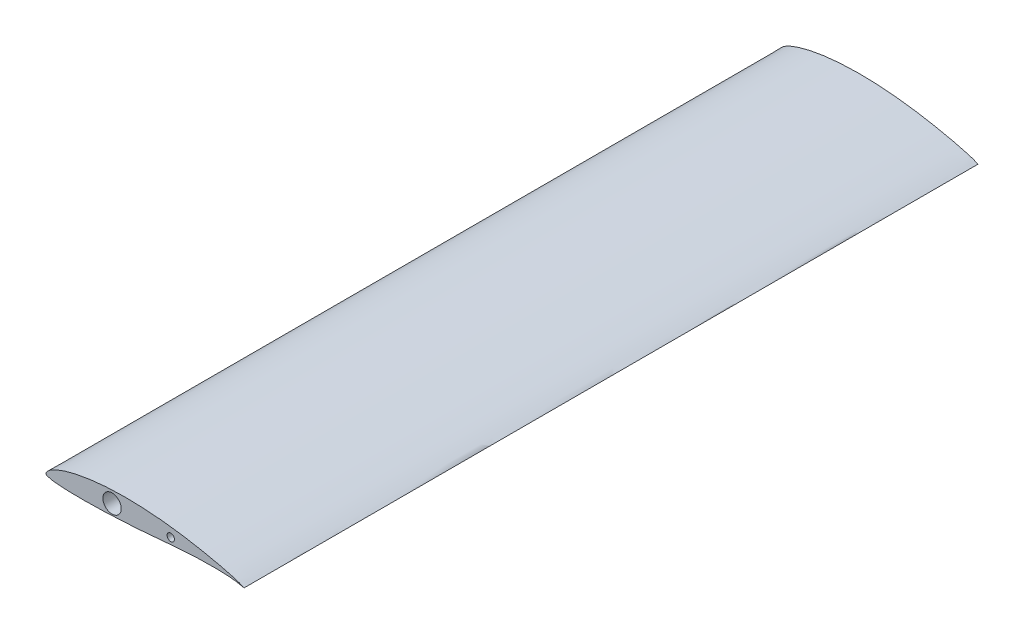
ISO-10303-21;
HEADER;
FILE_DESCRIPTION(('STEP AP214'),'2;1');
FILE_NAME('part.step','',(''),(''),'','','');
FILE_SCHEMA(('AUTOMOTIVE_DESIGN { 1 0 10303 214 1 1 1 1 }'));
ENDSEC;
DATA;
#1=APPLICATION_CONTEXT('core data for automotive mechanical design processes');
#2=APPLICATION_PROTOCOL_DEFINITION('international standard','automotive_design',2000,#1);
#3=PRODUCT_CONTEXT('',#1,'mechanical');
#4=PRODUCT('Part','Part','',(#3));
#5=PRODUCT_RELATED_PRODUCT_CATEGORY('part','',(#4));
#6=PRODUCT_DEFINITION_FORMATION('','',#4);
#7=PRODUCT_DEFINITION_CONTEXT('part definition',#1,'design');
#8=PRODUCT_DEFINITION('design','',#6,#7);
#9=PRODUCT_DEFINITION_SHAPE('','',#8);
#10=(LENGTH_UNIT() NAMED_UNIT(*) SI_UNIT(.MILLI.,.METRE.));
#11=(NAMED_UNIT(*) PLANE_ANGLE_UNIT() SI_UNIT($,.RADIAN.));
#12=(NAMED_UNIT(*) SI_UNIT($,.STERADIAN.) SOLID_ANGLE_UNIT());
#13=UNCERTAINTY_MEASURE_WITH_UNIT(LENGTH_MEASURE(1.E-05),#10,'distance_accuracy_value','');
#14=(GEOMETRIC_REPRESENTATION_CONTEXT(3) GLOBAL_UNCERTAINTY_ASSIGNED_CONTEXT((#13)) GLOBAL_UNIT_ASSIGNED_CONTEXT((#10,
#11,#12)) REPRESENTATION_CONTEXT('',''));
#15=CARTESIAN_POINT('',(0.,0.,0.));
#16=DIRECTION('',(0.,0.,1.));
#17=DIRECTION('',(1.,0.,0.));
#18=AXIS2_PLACEMENT_3D('',#15,#16,#17);
#19=CARTESIAN_POINT('',(270.,0.,-1000.));
#20=CARTESIAN_POINT('',(269.997712349188,0.0234686611256753,-1000.));
#21=CARTESIAN_POINT('',(268.237544940999,0.666521838597682,-1000.));
#22=CARTESIAN_POINT('',(266.567167257241,1.46678966420109,-1000.));
#23=CARTESIAN_POINT('',(262.675565234946,3.01541236049875,-1000.));
#24=CARTESIAN_POINT('',(257.913204906047,4.57241999430303,-1000.));
#25=CARTESIAN_POINT('',(251.73204691059,6.33251118051269,-1000.));
#26=CARTESIAN_POINT('',(244.411227291845,8.23757547132939,-1000.));
#27=CARTESIAN_POINT('',(235.957624235031,10.2728144558493,-1000.));
#28=CARTESIAN_POINT('',(226.514158981901,12.3893388504072,-1000.));
#29=CARTESIAN_POINT('',(216.193353242997,14.5408619660615,-1000.));
#30=CARTESIAN_POINT('',(205.131334675445,16.6775446846104,-1000.));
#31=CARTESIAN_POINT('',(193.456704411805,18.7297695998892,-1000.));
#32=CARTESIAN_POINT('',(181.297741572979,20.6324475689059,-1000.));
#33=CARTESIAN_POINT('',(168.767775931884,22.3116653675687,-1000.));
#34=CARTESIAN_POINT('',(155.975282970602,23.7079240823725,-1000.));
#35=CARTESIAN_POINT('',(143.035274216822,24.8048562112978,-1000.));
#36=CARTESIAN_POINT('',(130.061683689652,25.5801941607533,-1000.));
#37=CARTESIAN_POINT('',(117.173431648326,26.0002870023156,-1000.));
#38=CARTESIAN_POINT('',(104.483656181065,26.0575961543031,-1000.));
#39=CARTESIAN_POINT('',(92.1043755010552,25.7531475308751,-1000.));
#40=CARTESIAN_POINT('',(80.1394774009738,25.0742351928149,-1000.));
#41=CARTESIAN_POINT('',(68.6900371078556,24.0380742657958,-1000.));
#42=CARTESIAN_POINT('',(57.8508881437444,22.6699130708634,-1000.));
#43=CARTESIAN_POINT('',(47.7143437152034,21.012498661415,-1000.));
#44=CARTESIAN_POINT('',(38.3731688496213,19.0872173409911,-1000.));
#45=CARTESIAN_POINT('',(29.9084239228661,16.9557577669825,-1000.));
#46=CARTESIAN_POINT('',(22.3989734163653,14.6443999986465,-1000.));
#47=CARTESIAN_POINT('',(15.9079033402757,12.2158951402086,-1000.));
#48=CARTESIAN_POINT('',(10.4843260994342,9.72016383184442,-1000.));
#49=CARTESIAN_POINT('',(6.17701570310239,7.22086075585639,-1000.));
#50=CARTESIAN_POINT('',(2.96116420805311,4.74120142257406,-1000.));
#51=CARTESIAN_POINT('',(0.976626840598714,2.42611562982906,-1000.));
#52=CARTESIAN_POINT('',(0.0237044844557384,0.790715423622603,-1000.));
#53=CARTESIAN_POINT('',(-0.0162040088825778,-0.469721469617103,-1000.));
#54=CARTESIAN_POINT('',(0.800260735100484,-1.83607096740891,-1000.));
#55=CARTESIAN_POINT('',(3.49214110344745,-2.62953771203089,-1000.));
#56=CARTESIAN_POINT('',(7.30797165240786,-3.66267648937733,-1000.));
#57=CARTESIAN_POINT('',(12.6565956454472,-4.39911743413203,-1000.));
#58=CARTESIAN_POINT('',(19.3193886145286,-5.03288942314606,-1000.));
#59=CARTESIAN_POINT('',(27.2905068620494,-5.46979820264928,-1000.));
#60=CARTESIAN_POINT('',(36.4621699832966,-5.73867476423236,-1000.));
#61=CARTESIAN_POINT('',(46.7414412352293,-5.84000525497753,-1000.));
#62=CARTESIAN_POINT('',(58.0104590527028,-5.77015970140565,-1000.));
#63=CARTESIAN_POINT('',(70.1433505727269,-5.53682953906036,-1000.));
#64=CARTESIAN_POINT('',(83.0071440525755,-5.14081230033932,-1000.));
#65=CARTESIAN_POINT('',(96.4628511642711,-4.56590673235837,-1000.));
#66=CARTESIAN_POINT('',(110.37398366241,-3.8270098283305,-1000.));
#67=CARTESIAN_POINT('',(124.616655035357,-2.89299856695057,-1000.));
#68=CARTESIAN_POINT('',(139.099460234209,-1.73634558064927,-1000.));
#69=CARTESIAN_POINT('',(153.734791933855,-0.400812922822165,-1000.));
#70=CARTESIAN_POINT('',(168.40973375314,0.892284934259414,-1000.));
#71=CARTESIAN_POINT('',(182.933903609888,2.04143507217637,-1000.));
#72=CARTESIAN_POINT('',(197.078170060053,2.95921503400767,-1000.));
#73=CARTESIAN_POINT('',(210.604377411182,3.57903703483429,-1000.));
#74=CARTESIAN_POINT('',(223.266715876022,3.87437613460032,-1000.));
#75=CARTESIAN_POINT('',(234.840539210252,3.81861077039356,-1000.));
#76=CARTESIAN_POINT('',(245.04773169024,3.45329310537476,-1000.));
#77=CARTESIAN_POINT('',(253.77858024118,2.76286493967301,-1000.));
#78=CARTESIAN_POINT('',(260.440654454045,1.94222962723521,-1000.));
#79=CARTESIAN_POINT('',(265.781454331532,0.929874856989155,-1000.));
#80=CARTESIAN_POINT('',(267.932950880897,0.533749209448357,-1000.));
#81=CARTESIAN_POINT('',(270.002416438342,-0.0247898727749039,-1000.));
#82=CARTESIAN_POINT('',(270.,0.,-1000.));
#83=B_SPLINE_CURVE_WITH_KNOTS('',3,(#19,#20,#21,#22,#23,#24,#25,#26,#27,#28,#29,#30,#31,#32,#33,
#34,#35,#36,#37,#38,#39,#40,#41,#42,#43,#44,#45,#46,#47,#48,#49,#50,#51,#52,#53,#54,#55,#56,#57,
#58,#59,#60,#61,#62,#63,#64,#65,#66,#67,#68,#69,#70,#71,#72,#73,#74,#75,#76,#77,#78,#79,#80,#81,
#82),.UNSPECIFIED.,.T.,.F.,(4,1,1,1,1,1,1,1,1,1,1,1,1,1,1,1,1,1,1,1,1,1,1,1,1,1,1,1,1,1,1,1,1,1,
1,1,1,1,1,1,1,1,1,1,1,1,1,1,1,1,1,1,1,1,1,1,1,1,1,1,1,4),(0.,0.00169352365364151,
0.00639544747949767,0.0134616508959298,0.0227535749736499,0.0343673071517184,0.0481910226954883,
0.064031392481717,0.0816806172414247,0.100894124121338,0.121431793819588,0.143025453493653,
0.165434010835678,0.188439038764568,0.211855124404938,0.235496289450678,0.259143745164546,
0.282614908314604,0.30570154453718,0.328231583662433,0.350030433806964,0.370943883213179,
0.390816528552158,0.409505873078083,0.426856550273814,0.442733384525219,0.457018387509693,
0.469615069942757,0.480449695456551,0.489471860268703,0.496730301180351,0.502329146614106,
0.506255660132997,0.506441944995434,0.509181515928635,0.513913846214958,0.521178418676576,
0.530944156675701,0.543144508951145,0.557669673966592,0.574383525920581,0.593109554408618,
0.613638211877394,0.635743557157375,0.659184094922803,0.683713689413154,0.709075753928382,
0.735036066440786,0.761429738598203,0.7881837663948,0.815056829999431,0.84164476376198,
0.867513560484753,0.892232408519161,0.915363656349594,0.936485324642643,0.955199831872162,
0.971104187426938,0.983751025641108,0.992812817585366,0.998211136302568,1.),.UNSPECIFIED.);
#84=DIRECTION('',(0.,0.,1.));
#85=VECTOR('',#84,1.);
#86=SURFACE_OF_LINEAR_EXTRUSION('',#83,#85);
#87=CARTESIAN_POINT('',(270.,0.,-1000.));
#88=VERTEX_POINT('',#87);
#89=EDGE_CURVE('E10',#88,#88,#83,.T.);
#90=ORIENTED_EDGE('',*,*,#89,.T.);
#91=EDGE_LOOP('',(#90));
#92=FACE_BOUND('',#91,.T.);
#93=CARTESIAN_POINT('',(270.,0.,0.));
#94=CARTESIAN_POINT('',(269.997712349188,0.0234686611256753,0.));
#95=CARTESIAN_POINT('',(268.237544940999,0.666521838597682,0.));
#96=CARTESIAN_POINT('',(266.567167257241,1.46678966420109,0.));
#97=CARTESIAN_POINT('',(262.675565234946,3.01541236049875,0.));
#98=CARTESIAN_POINT('',(257.913204906047,4.57241999430303,0.));
#99=CARTESIAN_POINT('',(251.73204691059,6.33251118051269,0.));
#100=CARTESIAN_POINT('',(244.411227291845,8.23757547132939,0.));
#101=CARTESIAN_POINT('',(235.957624235031,10.2728144558493,0.));
#102=CARTESIAN_POINT('',(226.514158981901,12.3893388504072,0.));
#103=CARTESIAN_POINT('',(216.193353242997,14.5408619660615,0.));
#104=CARTESIAN_POINT('',(205.131334675445,16.6775446846104,0.));
#105=CARTESIAN_POINT('',(193.456704411805,18.7297695998892,0.));
#106=CARTESIAN_POINT('',(181.297741572979,20.6324475689059,0.));
#107=CARTESIAN_POINT('',(168.767775931884,22.3116653675687,0.));
#108=CARTESIAN_POINT('',(155.975282970602,23.7079240823725,0.));
#109=CARTESIAN_POINT('',(143.035274216822,24.8048562112978,0.));
#110=CARTESIAN_POINT('',(130.061683689652,25.5801941607533,0.));
#111=CARTESIAN_POINT('',(117.173431648326,26.0002870023156,0.));
#112=CARTESIAN_POINT('',(104.483656181065,26.0575961543031,0.));
#113=CARTESIAN_POINT('',(92.1043755010552,25.7531475308751,0.));
#114=CARTESIAN_POINT('',(80.1394774009738,25.0742351928149,0.));
#115=CARTESIAN_POINT('',(68.6900371078556,24.0380742657958,0.));
#116=CARTESIAN_POINT('',(57.8508881437444,22.6699130708634,0.));
#117=CARTESIAN_POINT('',(47.7143437152034,21.012498661415,0.));
#118=CARTESIAN_POINT('',(38.3731688496213,19.0872173409911,0.));
#119=CARTESIAN_POINT('',(29.9084239228661,16.9557577669825,0.));
#120=CARTESIAN_POINT('',(22.3989734163653,14.6443999986465,0.));
#121=CARTESIAN_POINT('',(15.9079033402757,12.2158951402086,0.));
#122=CARTESIAN_POINT('',(10.4843260994342,9.72016383184442,0.));
#123=CARTESIAN_POINT('',(6.17701570310239,7.22086075585639,0.));
#124=CARTESIAN_POINT('',(2.96116420805311,4.74120142257406,0.));
#125=CARTESIAN_POINT('',(0.976626840598714,2.42611562982906,0.));
#126=CARTESIAN_POINT('',(0.0237044844557384,0.790715423622603,0.));
#127=CARTESIAN_POINT('',(-0.0162040088825778,-0.469721469617103,0.));
#128=CARTESIAN_POINT('',(0.800260735100484,-1.83607096740891,0.));
#129=CARTESIAN_POINT('',(3.49214110344745,-2.62953771203089,0.));
#130=CARTESIAN_POINT('',(7.30797165240786,-3.66267648937733,0.));
#131=CARTESIAN_POINT('',(12.6565956454472,-4.39911743413203,0.));
#132=CARTESIAN_POINT('',(19.3193886145286,-5.03288942314606,0.));
#133=CARTESIAN_POINT('',(27.2905068620494,-5.46979820264928,0.));
#134=CARTESIAN_POINT('',(36.4621699832966,-5.73867476423236,0.));
#135=CARTESIAN_POINT('',(46.7414412352293,-5.84000525497753,0.));
#136=CARTESIAN_POINT('',(58.0104590527028,-5.77015970140565,0.));
#137=CARTESIAN_POINT('',(70.1433505727269,-5.53682953906036,0.));
#138=CARTESIAN_POINT('',(83.0071440525755,-5.14081230033932,0.));
#139=CARTESIAN_POINT('',(96.4628511642711,-4.56590673235837,0.));
#140=CARTESIAN_POINT('',(110.37398366241,-3.8270098283305,0.));
#141=CARTESIAN_POINT('',(124.616655035357,-2.89299856695057,0.));
#142=CARTESIAN_POINT('',(139.099460234209,-1.73634558064927,0.));
#143=CARTESIAN_POINT('',(153.734791933855,-0.400812922822165,0.));
#144=CARTESIAN_POINT('',(168.40973375314,0.892284934259414,0.));
#145=CARTESIAN_POINT('',(182.933903609888,2.04143507217637,0.));
#146=CARTESIAN_POINT('',(197.078170060053,2.95921503400767,0.));
#147=CARTESIAN_POINT('',(210.604377411182,3.57903703483429,0.));
#148=CARTESIAN_POINT('',(223.266715876022,3.87437613460032,0.));
#149=CARTESIAN_POINT('',(234.840539210252,3.81861077039356,0.));
#150=CARTESIAN_POINT('',(245.04773169024,3.45329310537476,0.));
#151=CARTESIAN_POINT('',(253.77858024118,2.76286493967301,0.));
#152=CARTESIAN_POINT('',(260.440654454045,1.94222962723521,0.));
#153=CARTESIAN_POINT('',(265.781454331532,0.929874856989155,0.));
#154=CARTESIAN_POINT('',(267.932950880897,0.533749209448357,0.));
#155=CARTESIAN_POINT('',(270.002416438342,-0.0247898727749039,0.));
#156=CARTESIAN_POINT('',(270.,0.,0.));
#157=B_SPLINE_CURVE_WITH_KNOTS('',3,(#93,#94,#95,#96,#97,#98,#99,#100,#101,#102,#103,#104,#105,
#106,#107,#108,#109,#110,#111,#112,#113,#114,#115,#116,#117,#118,#119,#120,#121,#122,#123,#124,
#125,#126,#127,#128,#129,#130,#131,#132,#133,#134,#135,#136,#137,#138,#139,#140,#141,#142,#143,
#144,#145,#146,#147,#148,#149,#150,#151,#152,#153,#154,#155,#156),.UNSPECIFIED.,.T.,.F.,(4,1,1,
1,1,1,1,1,1,1,1,1,1,1,1,1,1,1,1,1,1,1,1,1,1,1,1,1,1,1,1,1,1,1,1,1,1,1,1,1,1,1,1,1,1,1,1,1,1,1,1,
1,1,1,1,1,1,1,1,1,1,4),(0.,0.00169352365364151,0.00639544747949767,0.0134616508959298,
0.0227535749736499,0.0343673071517184,0.0481910226954883,0.064031392481717,0.0816806172414247,
0.100894124121338,0.121431793819588,0.143025453493653,0.165434010835678,0.188439038764568,
0.211855124404938,0.235496289450678,0.259143745164546,0.282614908314604,0.30570154453718,
0.328231583662433,0.350030433806964,0.370943883213179,0.390816528552158,0.409505873078083,
0.426856550273814,0.442733384525219,0.457018387509693,0.469615069942757,0.480449695456551,
0.489471860268703,0.496730301180351,0.502329146614106,0.506255660132997,0.506441944995434,
0.509181515928635,0.513913846214958,0.521178418676576,0.530944156675701,0.543144508951145,
0.557669673966592,0.574383525920581,0.593109554408618,0.613638211877394,0.635743557157375,
0.659184094922803,0.683713689413154,0.709075753928382,0.735036066440786,0.761429738598203,
0.7881837663948,0.815056829999431,0.84164476376198,0.867513560484753,0.892232408519161,
0.915363656349594,0.936485324642643,0.955199831872162,0.971104187426938,0.983751025641108,
0.992812817585366,0.998211136302568,1.),.UNSPECIFIED.);
#158=CARTESIAN_POINT('',(270.,0.,0.));
#159=VERTEX_POINT('',#158);
#160=EDGE_CURVE('E39',#159,#159,#157,.T.);
#161=ORIENTED_EDGE('',*,*,#160,.F.);
#162=EDGE_LOOP('',(#161));
#163=FACE_BOUND('',#162,.T.);
#164=ADVANCED_FACE('F35',(#92,#163),#86,.T.);
#165=CARTESIAN_POINT('',(1.62332381853687,3.13497524933791,-1000.));
#166=DIRECTION('',(0.,0.,1.));
#167=DIRECTION('',(-1.,0.,0.));
#168=AXIS2_PLACEMENT_3D('',#165,#166,#167);
#169=PLANE('',#168);
#170=CARTESIAN_POINT('',(90.,9.60326732864512,-1000.));
#171=DIRECTION('',(0.,0.,1.));
#172=DIRECTION('',(1.,0.,0.));
#173=AXIS2_PLACEMENT_3D('',#170,#171,#172);
#174=CIRCLE('',#173,12.5);
#175=CARTESIAN_POINT('',(102.5,9.60326732864512,-1000.));
#176=VERTEX_POINT('',#175);
#177=EDGE_CURVE('E47',#176,#176,#174,.T.);
#178=ORIENTED_EDGE('',*,*,#177,.T.);
#179=EDGE_LOOP('',(#178));
#180=FACE_BOUND('',#179,.T.);
#181=CARTESIAN_POINT('',(170.,9.60326732864512,-1000.));
#182=DIRECTION('',(0.,0.,1.));
#183=DIRECTION('',(1.,0.,0.));
#184=AXIS2_PLACEMENT_3D('',#181,#182,#183);
#185=CIRCLE('',#184,4.99999999999999);
#186=CARTESIAN_POINT('',(175.,9.60326732864512,-1000.));
#187=VERTEX_POINT('',#186);
#188=EDGE_CURVE('E52',#187,#187,#185,.T.);
#189=ORIENTED_EDGE('',*,*,#188,.T.);
#190=EDGE_LOOP('',(#189));
#191=FACE_BOUND('',#190,.T.);
#192=ORIENTED_EDGE('',*,*,#89,.F.);
#193=EDGE_LOOP('',(#192));
#194=FACE_BOUND('',#193,.T.);
#195=ADVANCED_FACE('F67',(#180,#191,#194),#169,.F.);
#196=CARTESIAN_POINT('',(1.62332381853687,3.13497524933791,0.));
#197=DIRECTION('',(0.,0.,1.));
#198=DIRECTION('',(-1.,0.,0.));
#199=AXIS2_PLACEMENT_3D('',#196,#197,#198);
#200=PLANE('',#199);
#201=CARTESIAN_POINT('',(90.,9.60326732864512,0.));
#202=DIRECTION('',(0.,0.,1.));
#203=DIRECTION('',(1.,0.,0.));
#204=AXIS2_PLACEMENT_3D('',#201,#202,#203);
#205=CIRCLE('',#204,12.5);
#206=CARTESIAN_POINT('',(102.5,9.60326732864512,0.));
#207=VERTEX_POINT('',#206);
#208=EDGE_CURVE('E61',#207,#207,#205,.T.);
#209=ORIENTED_EDGE('',*,*,#208,.F.);
#210=EDGE_LOOP('',(#209));
#211=FACE_BOUND('',#210,.T.);
#212=CARTESIAN_POINT('',(170.,9.60326732864512,0.));
#213=DIRECTION('',(0.,0.,1.));
#214=DIRECTION('',(1.,0.,0.));
#215=AXIS2_PLACEMENT_3D('',#212,#213,#214);
#216=CIRCLE('',#215,4.99999999999999);
#217=CARTESIAN_POINT('',(175.,9.60326732864512,0.));
#218=VERTEX_POINT('',#217);
#219=EDGE_CURVE('E58',#218,#218,#216,.T.);
#220=ORIENTED_EDGE('',*,*,#219,.F.);
#221=EDGE_LOOP('',(#220));
#222=FACE_BOUND('',#221,.T.);
#223=ORIENTED_EDGE('',*,*,#160,.T.);
#224=EDGE_LOOP('',(#223));
#225=FACE_BOUND('',#224,.T.);
#226=ADVANCED_FACE('F77',(#211,#222,#225),#200,.T.);
#227=CARTESIAN_POINT('',(170.,9.60326732864512,-1000.));
#228=DIRECTION('',(0.,0.,1.));
#229=DIRECTION('',(-1.,0.,0.));
#230=AXIS2_PLACEMENT_3D('',#227,#228,#229);
#231=CYLINDRICAL_SURFACE('',#230,4.99999999999999);
#232=ORIENTED_EDGE('',*,*,#188,.F.);
#233=EDGE_LOOP('',(#232));
#234=FACE_BOUND('',#233,.T.);
#235=ORIENTED_EDGE('',*,*,#219,.T.);
#236=EDGE_LOOP('',(#235));
#237=FACE_BOUND('',#236,.T.);
#238=ADVANCED_FACE('F73',(#234,#237),#231,.F.);
#239=CARTESIAN_POINT('',(90.,9.60326732864512,-1000.));
#240=DIRECTION('',(0.,0.,1.));
#241=DIRECTION('',(-1.,0.,0.));
#242=AXIS2_PLACEMENT_3D('',#239,#240,#241);
#243=CYLINDRICAL_SURFACE('',#242,12.5);
#244=ORIENTED_EDGE('',*,*,#177,.F.);
#245=EDGE_LOOP('',(#244));
#246=FACE_BOUND('',#245,.T.);
#247=ORIENTED_EDGE('',*,*,#208,.T.);
#248=EDGE_LOOP('',(#247));
#249=FACE_BOUND('',#248,.T.);
#250=ADVANCED_FACE('F70',(#246,#249),#243,.F.);
#251=CLOSED_SHELL('',(#164,#195,#226,#238,#250));
#252=MANIFOLD_SOLID_BREP('B2',#251);
#253=ADVANCED_BREP_SHAPE_REPRESENTATION('',(#18,#252),#14);
#254=SHAPE_DEFINITION_REPRESENTATION(#9,#253);
ENDSEC;
END-ISO-10303-21;
